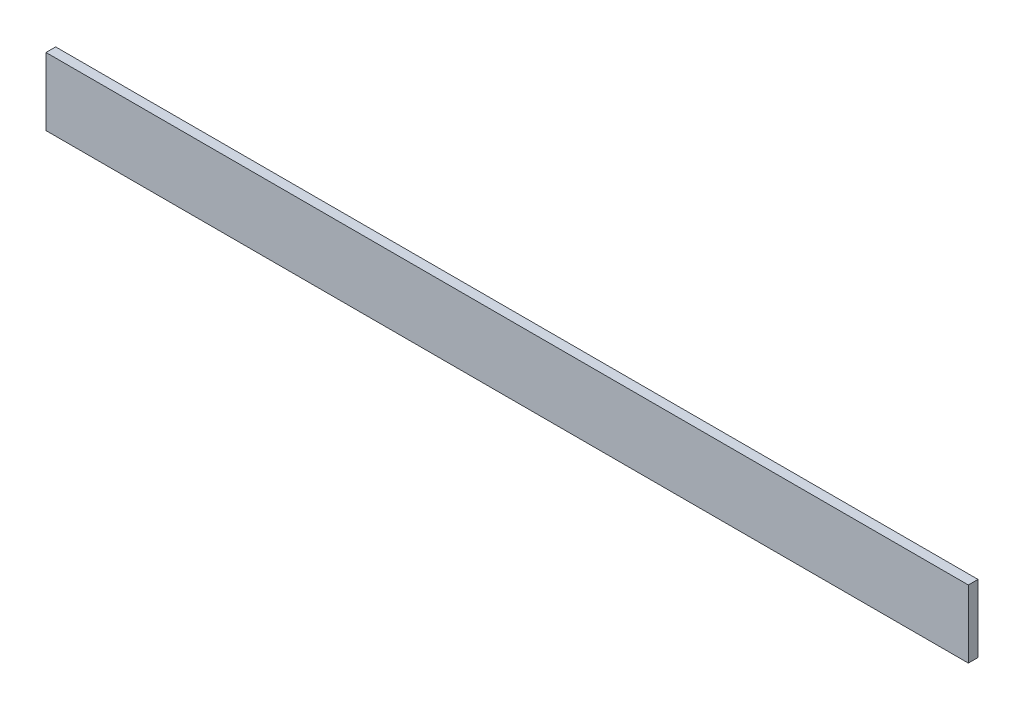
ISO-10303-21;
HEADER;
FILE_DESCRIPTION(('STEP AP214'),'2;1');
FILE_NAME('part.step','',(''),(''),'','','');
FILE_SCHEMA(('AUTOMOTIVE_DESIGN { 1 0 10303 214 1 1 1 1 }'));
ENDSEC;
DATA;
#1=APPLICATION_CONTEXT('core data for automotive mechanical design processes');
#2=APPLICATION_PROTOCOL_DEFINITION('international standard','automotive_design',2000,#1);
#3=PRODUCT_CONTEXT('',#1,'mechanical');
#4=PRODUCT('Part','Part','',(#3));
#5=PRODUCT_RELATED_PRODUCT_CATEGORY('part','',(#4));
#6=PRODUCT_DEFINITION_FORMATION('','',#4);
#7=PRODUCT_DEFINITION_CONTEXT('part definition',#1,'design');
#8=PRODUCT_DEFINITION('design','',#6,#7);
#9=PRODUCT_DEFINITION_SHAPE('','',#8);
#10=(LENGTH_UNIT() NAMED_UNIT(*) SI_UNIT(.MILLI.,.METRE.));
#11=(NAMED_UNIT(*) PLANE_ANGLE_UNIT() SI_UNIT($,.RADIAN.));
#12=(NAMED_UNIT(*) SI_UNIT($,.STERADIAN.) SOLID_ANGLE_UNIT());
#13=UNCERTAINTY_MEASURE_WITH_UNIT(LENGTH_MEASURE(1.E-05),#10,'distance_accuracy_value','');
#14=(GEOMETRIC_REPRESENTATION_CONTEXT(3) GLOBAL_UNCERTAINTY_ASSIGNED_CONTEXT((#13)) GLOBAL_UNIT_ASSIGNED_CONTEXT((#10,
#11,#12)) REPRESENTATION_CONTEXT('',''));
#15=CARTESIAN_POINT('',(0.,0.,0.));
#16=DIRECTION('',(0.,0.,1.));
#17=DIRECTION('',(1.,0.,0.));
#18=AXIS2_PLACEMENT_3D('',#15,#16,#17);
#19=CARTESIAN_POINT('',(477.,35.,-10.));
#20=DIRECTION('',(1.,0.,0.));
#21=DIRECTION('',(0.,0.,-1.));
#22=AXIS2_PLACEMENT_3D('',#19,#20,#21);
#23=PLANE('',#22);
#24=DIRECTION('',(0.,1.,0.));
#25=VECTOR('',#24,1.);
#26=CARTESIAN_POINT('',(477.,35.,0.));
#27=LINE('',#26,#25);
#28=CARTESIAN_POINT('',(477.,-35.,0.));
#29=VERTEX_POINT('',#28);
#30=CARTESIAN_POINT('',(477.,35.,0.));
#31=VERTEX_POINT('',#30);
#32=EDGE_CURVE('E100',#29,#31,#27,.T.);
#33=ORIENTED_EDGE('',*,*,#32,.F.);
#34=DIRECTION('',(0.,0.,1.));
#35=VECTOR('',#34,1.);
#36=CARTESIAN_POINT('',(477.,-35.,-10.));
#37=LINE('',#36,#35);
#38=CARTESIAN_POINT('',(477.,-35.,-10.));
#39=VERTEX_POINT('',#38);
#40=EDGE_CURVE('E11',#39,#29,#37,.T.);
#41=ORIENTED_EDGE('',*,*,#40,.F.);
#42=DIRECTION('',(0.,1.,0.));
#43=VECTOR('',#42,1.);
#44=CARTESIAN_POINT('',(477.,35.,-10.));
#45=LINE('',#44,#43);
#46=CARTESIAN_POINT('',(477.,35.,-10.));
#47=VERTEX_POINT('',#46);
#48=EDGE_CURVE('E94',#39,#47,#45,.T.);
#49=ORIENTED_EDGE('',*,*,#48,.T.);
#50=DIRECTION('',(0.,0.,1.));
#51=VECTOR('',#50,1.);
#52=CARTESIAN_POINT('',(477.,35.,-10.));
#53=LINE('',#52,#51);
#54=EDGE_CURVE('E39',#47,#31,#53,.T.);
#55=ORIENTED_EDGE('',*,*,#54,.T.);
#56=EDGE_LOOP('',(#33,#41,#49,#55));
#57=FACE_BOUND('',#56,.T.);
#58=ADVANCED_FACE('F36',(#57),#23,.T.);
#59=CARTESIAN_POINT('',(-477.,-35.,-10.));
#60=DIRECTION('',(0.,-1.,0.));
#61=DIRECTION('',(0.,0.,-1.));
#62=AXIS2_PLACEMENT_3D('',#59,#60,#61);
#63=PLANE('',#62);
#64=DIRECTION('',(1.,0.,0.));
#65=VECTOR('',#64,1.);
#66=CARTESIAN_POINT('',(-477.,-35.,0.));
#67=LINE('',#66,#65);
#68=CARTESIAN_POINT('',(-477.,-35.,0.));
#69=VERTEX_POINT('',#68);
#70=EDGE_CURVE('E96',#69,#29,#67,.T.);
#71=ORIENTED_EDGE('',*,*,#70,.F.);
#72=DIRECTION('',(0.,0.,1.));
#73=VECTOR('',#72,1.);
#74=CARTESIAN_POINT('',(-477.,-35.,-10.));
#75=LINE('',#74,#73);
#76=CARTESIAN_POINT('',(-477.,-35.,-10.));
#77=VERTEX_POINT('',#76);
#78=EDGE_CURVE('E45',#77,#69,#75,.T.);
#79=ORIENTED_EDGE('',*,*,#78,.F.);
#80=DIRECTION('',(1.,0.,0.));
#81=VECTOR('',#80,1.);
#82=CARTESIAN_POINT('',(-477.,-35.,-10.));
#83=LINE('',#82,#81);
#84=EDGE_CURVE('E91',#77,#39,#83,.T.);
#85=ORIENTED_EDGE('',*,*,#84,.T.);
#86=ORIENTED_EDGE('',*,*,#40,.T.);
#87=EDGE_LOOP('',(#71,#79,#85,#86));
#88=FACE_BOUND('',#87,.T.);
#89=ADVANCED_FACE('F110',(#88),#63,.T.);
#90=CARTESIAN_POINT('',(-477.,35.,-10.));
#91=DIRECTION('',(-1.,0.,0.));
#92=DIRECTION('',(0.,0.,1.));
#93=AXIS2_PLACEMENT_3D('',#90,#91,#92);
#94=PLANE('',#93);
#95=DIRECTION('',(0.,-1.,0.));
#96=VECTOR('',#95,1.);
#97=CARTESIAN_POINT('',(-477.,35.,0.));
#98=LINE('',#97,#96);
#99=CARTESIAN_POINT('',(-477.,35.,0.));
#100=VERTEX_POINT('',#99);
#101=EDGE_CURVE('E86',#100,#69,#98,.T.);
#102=ORIENTED_EDGE('',*,*,#101,.F.);
#103=DIRECTION('',(0.,0.,1.));
#104=VECTOR('',#103,1.);
#105=CARTESIAN_POINT('',(-477.,35.,-10.));
#106=LINE('',#105,#104);
#107=CARTESIAN_POINT('',(-477.,35.,-10.));
#108=VERTEX_POINT('',#107);
#109=EDGE_CURVE('E81',#108,#100,#106,.T.);
#110=ORIENTED_EDGE('',*,*,#109,.F.);
#111=DIRECTION('',(0.,-1.,0.));
#112=VECTOR('',#111,1.);
#113=CARTESIAN_POINT('',(-477.,35.,-10.));
#114=LINE('',#113,#112);
#115=EDGE_CURVE('E84',#108,#77,#114,.T.);
#116=ORIENTED_EDGE('',*,*,#115,.T.);
#117=ORIENTED_EDGE('',*,*,#78,.T.);
#118=EDGE_LOOP('',(#102,#110,#116,#117));
#119=FACE_BOUND('',#118,.T.);
#120=ADVANCED_FACE('F83',(#119),#94,.T.);
#121=CARTESIAN_POINT('',(-477.,35.,-10.));
#122=DIRECTION('',(0.,1.,0.));
#123=DIRECTION('',(0.,0.,1.));
#124=AXIS2_PLACEMENT_3D('',#121,#122,#123);
#125=PLANE('',#124);
#126=DIRECTION('',(-1.,0.,0.));
#127=VECTOR('',#126,1.);
#128=CARTESIAN_POINT('',(-477.,35.,0.));
#129=LINE('',#128,#127);
#130=EDGE_CURVE('E103',#31,#100,#129,.T.);
#131=ORIENTED_EDGE('',*,*,#130,.F.);
#132=ORIENTED_EDGE('',*,*,#54,.F.);
#133=DIRECTION('',(-1.,0.,0.));
#134=VECTOR('',#133,1.);
#135=CARTESIAN_POINT('',(-477.,35.,-10.));
#136=LINE('',#135,#134);
#137=EDGE_CURVE('E90',#47,#108,#136,.T.);
#138=ORIENTED_EDGE('',*,*,#137,.T.);
#139=ORIENTED_EDGE('',*,*,#109,.T.);
#140=EDGE_LOOP('',(#131,#132,#138,#139));
#141=FACE_BOUND('',#140,.T.);
#142=ADVANCED_FACE('F93',(#141),#125,.T.);
#143=CARTESIAN_POINT('',(0.,0.,-10.));
#144=DIRECTION('',(0.,0.,1.));
#145=DIRECTION('',(1.,0.,0.));
#146=AXIS2_PLACEMENT_3D('',#143,#144,#145);
#147=PLANE('',#146);
#148=ORIENTED_EDGE('',*,*,#48,.F.);
#149=ORIENTED_EDGE('',*,*,#84,.F.);
#150=ORIENTED_EDGE('',*,*,#115,.F.);
#151=ORIENTED_EDGE('',*,*,#137,.F.);
#152=EDGE_LOOP('',(#148,#149,#150,#151));
#153=FACE_BOUND('',#152,.T.);
#154=ADVANCED_FACE('F89',(#153),#147,.F.);
#155=CARTESIAN_POINT('',(0.,0.,0.));
#156=DIRECTION('',(0.,0.,1.));
#157=DIRECTION('',(1.,0.,0.));
#158=AXIS2_PLACEMENT_3D('',#155,#156,#157);
#159=PLANE('',#158);
#160=ORIENTED_EDGE('',*,*,#32,.T.);
#161=ORIENTED_EDGE('',*,*,#130,.T.);
#162=ORIENTED_EDGE('',*,*,#101,.T.);
#163=ORIENTED_EDGE('',*,*,#70,.T.);
#164=EDGE_LOOP('',(#160,#161,#162,#163));
#165=FACE_BOUND('',#164,.T.);
#166=ADVANCED_FACE('F109',(#165),#159,.T.);
#167=CLOSED_SHELL('',(#58,#89,#120,#142,#154,#166));
#168=MANIFOLD_SOLID_BREP('B2',#167);
#169=ADVANCED_BREP_SHAPE_REPRESENTATION('',(#18,#168),#14);
#170=SHAPE_DEFINITION_REPRESENTATION(#9,#169);
ENDSEC;
END-ISO-10303-21;
